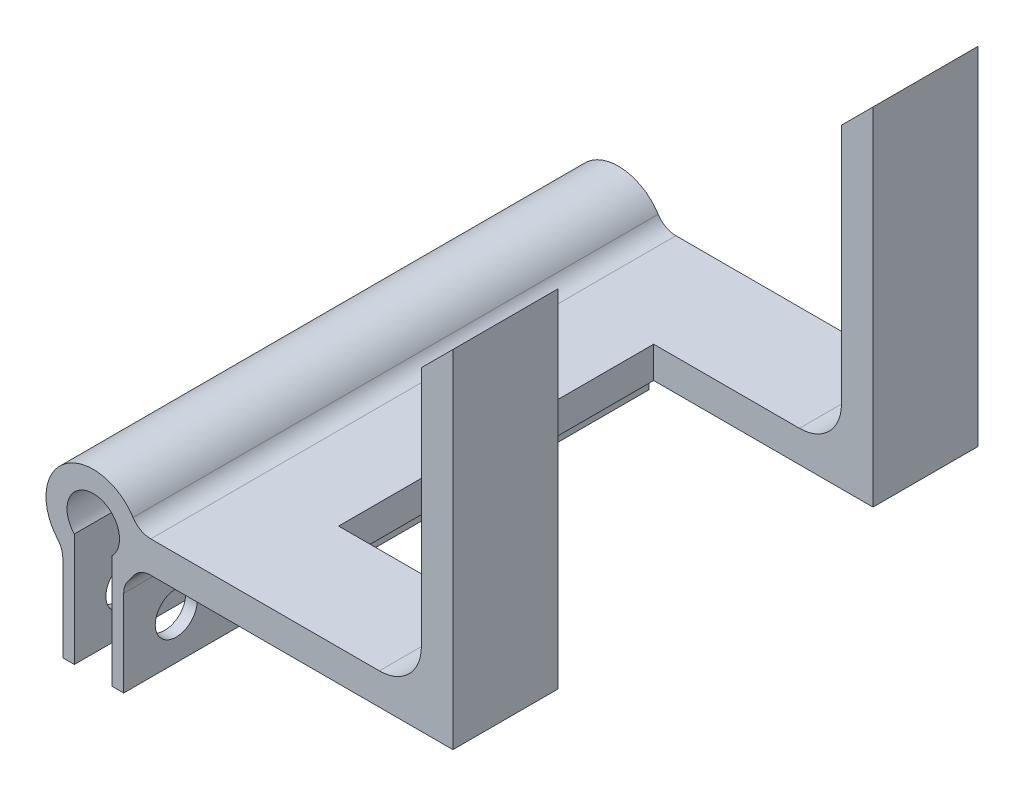
ISO-10303-21;
HEADER;
FILE_DESCRIPTION(('STEP AP214'),'2;1');
FILE_NAME('part.step','',(''),(''),'','','');
FILE_SCHEMA(('AUTOMOTIVE_DESIGN { 1 0 10303 214 1 1 1 1 }'));
ENDSEC;
DATA;
#1=APPLICATION_CONTEXT('core data for automotive mechanical design processes');
#2=APPLICATION_PROTOCOL_DEFINITION('international standard','automotive_design',2000,#1);
#3=PRODUCT_CONTEXT('',#1,'mechanical');
#4=PRODUCT('Part','Part','',(#3));
#5=PRODUCT_RELATED_PRODUCT_CATEGORY('part','',(#4));
#6=PRODUCT_DEFINITION_FORMATION('','',#4);
#7=PRODUCT_DEFINITION_CONTEXT('part definition',#1,'design');
#8=PRODUCT_DEFINITION('design','',#6,#7);
#9=PRODUCT_DEFINITION_SHAPE('','',#8);
#10=(LENGTH_UNIT() NAMED_UNIT(*) SI_UNIT(.MILLI.,.METRE.));
#11=(NAMED_UNIT(*) PLANE_ANGLE_UNIT() SI_UNIT($,.RADIAN.));
#12=(NAMED_UNIT(*) SI_UNIT($,.STERADIAN.) SOLID_ANGLE_UNIT());
#13=UNCERTAINTY_MEASURE_WITH_UNIT(LENGTH_MEASURE(1.E-05),#10,'distance_accuracy_value','');
#14=(GEOMETRIC_REPRESENTATION_CONTEXT(3) GLOBAL_UNCERTAINTY_ASSIGNED_CONTEXT((#13)) GLOBAL_UNIT_ASSIGNED_CONTEXT((#10,
#11,#12)) REPRESENTATION_CONTEXT('',''));
#15=CARTESIAN_POINT('',(0.,0.,0.));
#16=DIRECTION('',(0.,0.,1.));
#17=DIRECTION('',(1.,0.,0.));
#18=AXIS2_PLACEMENT_3D('',#15,#16,#17);
#19=CARTESIAN_POINT('',(17.1213203435596,0.75,0.));
#20=DIRECTION('',(1.,0.,0.));
#21=DIRECTION('',(0.,0.,-1.));
#22=AXIS2_PLACEMENT_3D('',#19,#20,#21);
#23=PLANE('',#22);
#24=DIRECTION('',(0.,-1.,0.));
#25=VECTOR('',#24,1.);
#26=CARTESIAN_POINT('',(17.1213203435596,0.75,20.));
#27=LINE('',#26,#25);
#28=CARTESIAN_POINT('',(17.1213203435596,15.75,20.));
#29=VERTEX_POINT('',#28);
#30=CARTESIAN_POINT('',(17.1213203435596,-0.75,20.));
#31=VERTEX_POINT('',#30);
#32=EDGE_CURVE('E242',#29,#31,#27,.T.);
#33=ORIENTED_EDGE('',*,*,#32,.F.);
#34=DIRECTION('',(0.,0.,-1.));
#35=VECTOR('',#34,1.);
#36=CARTESIAN_POINT('',(17.1213203435596,15.75,25.));
#37=LINE('',#36,#35);
#38=CARTESIAN_POINT('',(17.1213203435596,15.75,25.));
#39=VERTEX_POINT('',#38);
#40=EDGE_CURVE('E257',#39,#29,#37,.T.);
#41=ORIENTED_EDGE('',*,*,#40,.F.);
#42=DIRECTION('',(0.,1.,0.));
#43=VECTOR('',#42,1.);
#44=CARTESIAN_POINT('',(17.1213203435596,0.75,25.));
#45=LINE('',#44,#43);
#46=CARTESIAN_POINT('',(17.1213203435596,-0.75,25.));
#47=VERTEX_POINT('',#46);
#48=EDGE_CURVE('E276',#47,#39,#45,.T.);
#49=ORIENTED_EDGE('',*,*,#48,.F.);
#50=DIRECTION('',(0.,0.,1.));
#51=VECTOR('',#50,1.);
#52=CARTESIAN_POINT('',(17.1213203435596,-0.75,0.));
#53=LINE('',#52,#51);
#54=EDGE_CURVE('E273',#31,#47,#53,.T.);
#55=ORIENTED_EDGE('',*,*,#54,.F.);
#56=EDGE_LOOP('',(#33,#41,#49,#55));
#57=FACE_BOUND('',#56,.T.);
#58=ADVANCED_FACE('F41',(#57),#23,.T.);
#59=CARTESIAN_POINT('',(15.6213203435596,15.75,0.));
#60=DIRECTION('',(1.,0.,0.));
#61=DIRECTION('',(0.,0.,-1.));
#62=AXIS2_PLACEMENT_3D('',#59,#60,#61);
#63=PLANE('',#62);
#64=DIRECTION('',(0.,-1.,0.));
#65=VECTOR('',#64,1.);
#66=CARTESIAN_POINT('',(15.6213203435596,15.75,25.));
#67=LINE('',#66,#65);
#68=CARTESIAN_POINT('',(15.6213203435596,14.25,25.));
#69=VERTEX_POINT('',#68);
#70=CARTESIAN_POINT('',(15.6213203435596,2.75,25.));
#71=VERTEX_POINT('',#70);
#72=EDGE_CURVE('E260',#69,#71,#67,.T.);
#73=ORIENTED_EDGE('',*,*,#72,.F.);
#74=DIRECTION('',(0.,0.,-1.));
#75=VECTOR('',#74,1.);
#76=CARTESIAN_POINT('',(15.6213203435596,14.25,20.));
#77=LINE('',#76,#75);
#78=CARTESIAN_POINT('',(15.6213203435596,14.25,20.));
#79=VERTEX_POINT('',#78);
#80=EDGE_CURVE('E50',#69,#79,#77,.T.);
#81=ORIENTED_EDGE('',*,*,#80,.T.);
#82=DIRECTION('',(0.,-1.,0.));
#83=VECTOR('',#82,1.);
#84=CARTESIAN_POINT('',(15.6213203435596,15.75,20.));
#85=LINE('',#84,#83);
#86=CARTESIAN_POINT('',(15.6213203435596,2.75,20.));
#87=VERTEX_POINT('',#86);
#88=EDGE_CURVE('E240',#79,#87,#85,.T.);
#89=ORIENTED_EDGE('',*,*,#88,.T.);
#90=DIRECTION('',(0.,0.,1.));
#91=VECTOR('',#90,1.);
#92=CARTESIAN_POINT('',(15.6213203435596,2.75,0.));
#93=LINE('',#92,#91);
#94=EDGE_CURVE('E224',#87,#71,#93,.T.);
#95=ORIENTED_EDGE('',*,*,#94,.T.);
#96=EDGE_LOOP('',(#73,#81,#89,#95));
#97=FACE_BOUND('',#96,.T.);
#98=ADVANCED_FACE('F544',(#97),#63,.F.);
#99=CARTESIAN_POINT('',(2.12132034355964,0.75,0.));
#100=DIRECTION('',(0.,1.,0.));
#101=DIRECTION('',(0.,0.,1.));
#102=AXIS2_PLACEMENT_3D('',#99,#100,#101);
#103=PLANE('',#102);
#104=DIRECTION('',(-1.,0.,0.));
#105=VECTOR('',#104,1.);
#106=CARTESIAN_POINT('',(2.12132034355964,0.75,25.));
#107=LINE('',#106,#105);
#108=CARTESIAN_POINT('',(13.6213203435596,0.75,25.));
#109=VERTEX_POINT('',#108);
#110=CARTESIAN_POINT('',(2.73861278752583,0.75,25.));
#111=VERTEX_POINT('',#110);
#112=EDGE_CURVE('E268',#109,#111,#107,.T.);
#113=ORIENTED_EDGE('',*,*,#112,.F.);
#114=DIRECTION('',(0.,0.,1.));
#115=VECTOR('',#114,1.);
#116=CARTESIAN_POINT('',(13.6213203435596,0.75,0.));
#117=LINE('',#116,#115);
#118=CARTESIAN_POINT('',(13.6213203435596,0.75,20.));
#119=VERTEX_POINT('',#118);
#120=EDGE_CURVE('E380',#109,#119,#117,.F.);
#121=ORIENTED_EDGE('',*,*,#120,.T.);
#122=DIRECTION('',(1.,0.,0.));
#123=VECTOR('',#122,1.);
#124=CARTESIAN_POINT('',(2.12132034355965,0.75,20.));
#125=LINE('',#124,#123);
#126=CARTESIAN_POINT('',(6.68164111748477,0.750000000000001,20.));
#127=VERTEX_POINT('',#126);
#128=EDGE_CURVE('E249',#127,#119,#125,.T.);
#129=ORIENTED_EDGE('',*,*,#128,.F.);
#130=DIRECTION('',(0.,0.,1.));
#131=VECTOR('',#130,1.);
#132=CARTESIAN_POINT('',(6.68164111748477,0.75,0.));
#133=LINE('',#132,#131);
#134=CARTESIAN_POINT('',(6.68164111748477,0.750000000000001,5.));
#135=VERTEX_POINT('',#134);
#136=EDGE_CURVE('E254',#135,#127,#133,.T.);
#137=ORIENTED_EDGE('',*,*,#136,.F.);
#138=DIRECTION('',(-1.,0.,0.));
#139=VECTOR('',#138,1.);
#140=CARTESIAN_POINT('',(2.12132034355964,0.75,5.));
#141=LINE('',#140,#139);
#142=CARTESIAN_POINT('',(13.6213203435596,0.75,5.));
#143=VERTEX_POINT('',#142);
#144=EDGE_CURVE('E233',#143,#135,#141,.T.);
#145=ORIENTED_EDGE('',*,*,#144,.F.);
#146=DIRECTION('',(0.,0.,1.));
#147=VECTOR('',#146,1.);
#148=CARTESIAN_POINT('',(13.6213203435596,0.75,0.));
#149=LINE('',#148,#147);
#150=CARTESIAN_POINT('',(13.6213203435596,0.75,0.));
#151=VERTEX_POINT('',#150);
#152=EDGE_CURVE('E378',#143,#151,#149,.F.);
#153=ORIENTED_EDGE('',*,*,#152,.T.);
#154=DIRECTION('',(-1.,0.,0.));
#155=VECTOR('',#154,1.);
#156=CARTESIAN_POINT('',(2.12132034355964,0.75,0.));
#157=LINE('',#156,#155);
#158=CARTESIAN_POINT('',(2.73861278752583,0.75,0.));
#159=VERTEX_POINT('',#158);
#160=EDGE_CURVE('E271',#151,#159,#157,.T.);
#161=ORIENTED_EDGE('',*,*,#160,.T.);
#162=DIRECTION('',(0.,0.,-1.));
#163=VECTOR('',#162,1.);
#164=CARTESIAN_POINT('',(2.73861278752583,0.75,0.));
#165=LINE('',#164,#163);
#166=EDGE_CURVE('E357',#159,#111,#165,.F.);
#167=ORIENTED_EDGE('',*,*,#166,.T.);
#168=EDGE_LOOP('',(#113,#121,#129,#137,#145,#153,#161,#167));
#169=FACE_BOUND('',#168,.T.);
#170=ADVANCED_FACE('F487',(#169),#103,.T.);
#171=CARTESIAN_POINT('',(0.,0.,25.));
#172=DIRECTION('',(0.,0.,-1.));
#173=DIRECTION('',(-1.,0.,0.));
#174=AXIS2_PLACEMENT_3D('',#171,#172,#173);
#175=CYLINDRICAL_SURFACE('',#174,2.25);
#176=CARTESIAN_POINT('',(0.,0.,0.));
#177=DIRECTION('',(0.,0.,1.));
#178=DIRECTION('',(1.,0.,0.));
#179=AXIS2_PLACEMENT_3D('',#176,#177,#178);
#180=CIRCLE('',#179,2.25);
#181=CARTESIAN_POINT('',(1.89596269905634,1.21153846153846,0.));
#182=VERTEX_POINT('',#181);
#183=CARTESIAN_POINT('',(-1.69615384615385,-1.47836468105049,0.));
#184=VERTEX_POINT('',#183);
#185=EDGE_CURVE('E324',#182,#184,#180,.T.);
#186=ORIENTED_EDGE('',*,*,#185,.T.);
#187=DIRECTION('',(0.,0.,-1.));
#188=VECTOR('',#187,1.);
#189=CARTESIAN_POINT('',(-1.69615384615385,-1.47836468105049,25.));
#190=LINE('',#189,#188);
#191=CARTESIAN_POINT('',(-1.69615384615385,-1.47836468105049,25.));
#192=VERTEX_POINT('',#191);
#193=EDGE_CURVE('E342',#184,#192,#190,.F.);
#194=ORIENTED_EDGE('',*,*,#193,.T.);
#195=CARTESIAN_POINT('',(0.,0.,25.));
#196=DIRECTION('',(0.,0.,1.));
#197=DIRECTION('',(1.,0.,0.));
#198=AXIS2_PLACEMENT_3D('',#195,#196,#197);
#199=CIRCLE('',#198,2.25);
#200=CARTESIAN_POINT('',(1.89596269905634,1.21153846153846,25.));
#201=VERTEX_POINT('',#200);
#202=EDGE_CURVE('E331',#201,#192,#199,.T.);
#203=ORIENTED_EDGE('',*,*,#202,.F.);
#204=DIRECTION('',(0.,0.,-1.));
#205=VECTOR('',#204,1.);
#206=CARTESIAN_POINT('',(1.89596269905634,1.21153846153846,25.));
#207=LINE('',#206,#205);
#208=EDGE_CURVE('E340',#201,#182,#207,.T.);
#209=ORIENTED_EDGE('',*,*,#208,.T.);
#210=EDGE_LOOP('',(#186,#194,#203,#209));
#211=FACE_BOUND('',#210,.T.);
#212=ADVANCED_FACE('F469',(#211),#175,.T.);
#213=CARTESIAN_POINT('',(1.69615384615385,-1.47836468105049,25.));
#214=VERTEX_POINT('',#213);
#215=CARTESIAN_POINT('',(1.89596269905634,-1.21153846153846,25.));
#216=VERTEX_POINT('',#215);
#217=EDGE_CURVE('E327',#214,#216,#199,.T.);
#218=ORIENTED_EDGE('',*,*,#217,.F.);
#219=DIRECTION('',(0.,0.,-1.));
#220=VECTOR('',#219,1.);
#221=CARTESIAN_POINT('',(1.69615384615385,-1.47836468105049,25.));
#222=LINE('',#221,#220);
#223=CARTESIAN_POINT('',(1.69615384615385,-1.47836468105049,0.));
#224=VERTEX_POINT('',#223);
#225=EDGE_CURVE('E353',#214,#224,#222,.T.);
#226=ORIENTED_EDGE('',*,*,#225,.T.);
#227=CARTESIAN_POINT('',(1.89596269905634,-1.21153846153846,0.));
#228=VERTEX_POINT('',#227);
#229=EDGE_CURVE('E332',#224,#228,#180,.T.);
#230=ORIENTED_EDGE('',*,*,#229,.T.);
#231=DIRECTION('',(0.,0.,-1.));
#232=VECTOR('',#231,1.);
#233=CARTESIAN_POINT('',(1.89596269905634,-1.21153846153846,25.));
#234=LINE('',#233,#232);
#235=EDGE_CURVE('E350',#228,#216,#234,.F.);
#236=ORIENTED_EDGE('',*,*,#235,.T.);
#237=EDGE_LOOP('',(#218,#226,#230,#236));
#238=FACE_BOUND('',#237,.T.);
#239=ADVANCED_FACE('F508',(#238),#175,.T.);
#240=CARTESIAN_POINT('',(0.,0.,25.));
#241=DIRECTION('',(0.,0.,1.));
#242=DIRECTION('',(1.,0.,0.));
#243=AXIS2_PLACEMENT_3D('',#240,#241,#242);
#244=PLANE('',#243);
#245=ORIENTED_EDGE('',*,*,#48,.T.);
#246=DIRECTION('',(-0.707106781186545,-0.70710678118655,0.));
#247=VECTOR('',#246,1.);
#248=CARTESIAN_POINT('',(0.685660171779874,-0.685660171779869,25.));
#249=LINE('',#248,#247);
#250=EDGE_CURVE('E64',#39,#69,#249,.T.);
#251=ORIENTED_EDGE('',*,*,#250,.T.);
#252=ORIENTED_EDGE('',*,*,#72,.T.);
#253=CARTESIAN_POINT('',(13.6213203435596,2.75,25.));
#254=DIRECTION('',(0.,0.,1.));
#255=DIRECTION('',(1.,0.,0.));
#256=AXIS2_PLACEMENT_3D('',#253,#254,#255);
#257=CIRCLE('',#256,2.);
#258=EDGE_CURVE('E385',#71,#109,#257,.F.);
#259=ORIENTED_EDGE('',*,*,#258,.T.);
#260=ORIENTED_EDGE('',*,*,#112,.T.);
#261=CARTESIAN_POINT('',(2.73861278752583,1.75,25.));
#262=DIRECTION('',(0.,0.,1.));
#263=DIRECTION('',(1.,0.,0.));
#264=AXIS2_PLACEMENT_3D('',#261,#262,#263);
#265=CIRCLE('',#264,1.);
#266=EDGE_CURVE('E372',#111,#201,#265,.F.);
#267=ORIENTED_EDGE('',*,*,#266,.T.);
#268=ORIENTED_EDGE('',*,*,#202,.T.);
#269=CARTESIAN_POINT('',(-2.45,-2.13541565040626,25.));
#270=DIRECTION('',(0.,0.,1.));
#271=DIRECTION('',(1.,0.,0.));
#272=AXIS2_PLACEMENT_3D('',#269,#270,#271);
#273=CIRCLE('',#272,1.);
#274=CARTESIAN_POINT('',(-1.45,-2.13541565040626,25.));
#275=VERTEX_POINT('',#274);
#276=EDGE_CURVE('E360',#192,#275,#273,.F.);
#277=ORIENTED_EDGE('',*,*,#276,.T.);
#278=DIRECTION('',(0.,-1.,0.));
#279=VECTOR('',#278,1.);
#280=CARTESIAN_POINT('',(-1.45,0.,25.));
#281=LINE('',#280,#279);
#282=CARTESIAN_POINT('',(-1.45,-6.25,25.));
#283=VERTEX_POINT('',#282);
#284=EDGE_CURVE('E310',#275,#283,#281,.T.);
#285=ORIENTED_EDGE('',*,*,#284,.T.);
#286=DIRECTION('',(-1.,0.,0.));
#287=VECTOR('',#286,1.);
#288=CARTESIAN_POINT('',(-0.9,-6.25,25.));
#289=LINE('',#288,#287);
#290=CARTESIAN_POINT('',(-0.9,-6.25,25.));
#291=VERTEX_POINT('',#290);
#292=EDGE_CURVE('E283',#291,#283,#289,.T.);
#293=ORIENTED_EDGE('',*,*,#292,.F.);
#294=DIRECTION('',(0.,-1.,0.));
#295=VECTOR('',#294,1.);
#296=CARTESIAN_POINT('',(-0.9,0.,25.));
#297=LINE('',#296,#295);
#298=CARTESIAN_POINT('',(-0.9,-0.867467578644874,25.));
#299=VERTEX_POINT('',#298);
#300=EDGE_CURVE('E316',#299,#291,#297,.T.);
#301=ORIENTED_EDGE('',*,*,#300,.F.);
#302=CARTESIAN_POINT('',(0.,0.,25.));
#303=DIRECTION('',(0.,0.,1.));
#304=DIRECTION('',(1.,0.,0.));
#305=AXIS2_PLACEMENT_3D('',#302,#303,#304);
#306=CIRCLE('',#305,1.25);
#307=CARTESIAN_POINT('',(0.9,-0.867467578644874,25.));
#308=VERTEX_POINT('',#307);
#309=EDGE_CURVE('E321',#308,#299,#306,.T.);
#310=ORIENTED_EDGE('',*,*,#309,.F.);
#311=DIRECTION('',(0.,-1.,0.));
#312=VECTOR('',#311,1.);
#313=CARTESIAN_POINT('',(0.9,0.,25.));
#314=LINE('',#313,#312);
#315=CARTESIAN_POINT('',(0.9,-6.25,25.));
#316=VERTEX_POINT('',#315);
#317=EDGE_CURVE('E308',#308,#316,#314,.T.);
#318=ORIENTED_EDGE('',*,*,#317,.T.);
#319=DIRECTION('',(-1.,0.,0.));
#320=VECTOR('',#319,1.);
#321=CARTESIAN_POINT('',(1.45,-6.25,25.));
#322=LINE('',#321,#320);
#323=CARTESIAN_POINT('',(1.45,-6.25,25.));
#324=VERTEX_POINT('',#323);
#325=EDGE_CURVE('E295',#324,#316,#322,.T.);
#326=ORIENTED_EDGE('',*,*,#325,.F.);
#327=DIRECTION('',(0.,-1.,0.));
#328=VECTOR('',#327,1.);
#329=CARTESIAN_POINT('',(1.45,0.,25.));
#330=LINE('',#329,#328);
#331=CARTESIAN_POINT('',(1.45,-2.13541565040626,25.));
#332=VERTEX_POINT('',#331);
#333=EDGE_CURVE('E304',#332,#324,#330,.T.);
#334=ORIENTED_EDGE('',*,*,#333,.F.);
#335=CARTESIAN_POINT('',(2.45,-2.13541565040626,25.));
#336=DIRECTION('',(0.,0.,1.));
#337=DIRECTION('',(1.,0.,0.));
#338=AXIS2_PLACEMENT_3D('',#335,#336,#337);
#339=CIRCLE('',#338,1.);
#340=EDGE_CURVE('E364',#332,#214,#339,.F.);
#341=ORIENTED_EDGE('',*,*,#340,.T.);
#342=ORIENTED_EDGE('',*,*,#217,.T.);
#343=CARTESIAN_POINT('',(2.73861278752583,-1.75,25.));
#344=DIRECTION('',(0.,0.,1.));
#345=DIRECTION('',(1.,0.,0.));
#346=AXIS2_PLACEMENT_3D('',#343,#344,#345);
#347=CIRCLE('',#346,1.);
#348=CARTESIAN_POINT('',(2.73861278752583,-0.75,25.));
#349=VERTEX_POINT('',#348);
#350=EDGE_CURVE('E368',#216,#349,#347,.F.);
#351=ORIENTED_EDGE('',*,*,#350,.T.);
#352=DIRECTION('',(1.,0.,0.));
#353=VECTOR('',#352,1.);
#354=CARTESIAN_POINT('',(2.12132034355964,-0.75,25.));
#355=LINE('',#354,#353);
#356=EDGE_CURVE('E264',#349,#47,#355,.T.);
#357=ORIENTED_EDGE('',*,*,#356,.T.);
#358=EDGE_LOOP('',(#245,#251,#252,#259,#260,#267,#268,#277,#285,#293,#301,#310,#318,#326,#334,
#341,#342,#351,#357));
#359=FACE_BOUND('',#358,.T.);
#360=ADVANCED_FACE('F498',(#359),#244,.T.);
#361=CARTESIAN_POINT('',(0.,0.,0.));
#362=DIRECTION('',(0.,0.,1.));
#363=DIRECTION('',(1.,0.,0.));
#364=AXIS2_PLACEMENT_3D('',#361,#362,#363);
#365=PLANE('',#364);
#366=DIRECTION('',(0.,-1.,0.));
#367=VECTOR('',#366,1.);
#368=CARTESIAN_POINT('',(15.6213203435596,15.75,0.));
#369=LINE('',#368,#367);
#370=CARTESIAN_POINT('',(15.6213203435596,14.25,0.));
#371=VERTEX_POINT('',#370);
#372=CARTESIAN_POINT('',(15.6213203435596,2.75,0.));
#373=VERTEX_POINT('',#372);
#374=EDGE_CURVE('E262',#371,#373,#369,.T.);
#375=ORIENTED_EDGE('',*,*,#374,.F.);
#376=DIRECTION('',(0.707106781186545,0.70710678118655,0.));
#377=VECTOR('',#376,1.);
#378=CARTESIAN_POINT('',(17.1213203435596,15.75,0.));
#379=LINE('',#378,#377);
#380=CARTESIAN_POINT('',(17.1213203435596,15.75,0.));
#381=VERTEX_POINT('',#380);
#382=EDGE_CURVE('E409',#371,#381,#379,.T.);
#383=ORIENTED_EDGE('',*,*,#382,.T.);
#384=DIRECTION('',(0.,1.,0.));
#385=VECTOR('',#384,1.);
#386=CARTESIAN_POINT('',(17.1213203435596,0.75,0.));
#387=LINE('',#386,#385);
#388=CARTESIAN_POINT('',(17.1213203435596,-0.75,0.));
#389=VERTEX_POINT('',#388);
#390=EDGE_CURVE('E267',#389,#381,#387,.T.);
#391=ORIENTED_EDGE('',*,*,#390,.F.);
#392=DIRECTION('',(1.,0.,0.));
#393=VECTOR('',#392,1.);
#394=CARTESIAN_POINT('',(2.12132034355964,-0.75,0.));
#395=LINE('',#394,#393);
#396=CARTESIAN_POINT('',(2.73861278752583,-0.75,0.));
#397=VERTEX_POINT('',#396);
#398=EDGE_CURVE('E265',#397,#389,#395,.T.);
#399=ORIENTED_EDGE('',*,*,#398,.F.);
#400=CARTESIAN_POINT('',(2.73861278752583,-1.75,0.));
#401=DIRECTION('',(0.,0.,1.));
#402=DIRECTION('',(1.,0.,0.));
#403=AXIS2_PLACEMENT_3D('',#400,#401,#402);
#404=CIRCLE('',#403,1.);
#405=EDGE_CURVE('E370',#397,#228,#404,.T.);
#406=ORIENTED_EDGE('',*,*,#405,.T.);
#407=ORIENTED_EDGE('',*,*,#229,.F.);
#408=CARTESIAN_POINT('',(2.45,-2.13541565040626,0.));
#409=DIRECTION('',(0.,0.,1.));
#410=DIRECTION('',(1.,0.,0.));
#411=AXIS2_PLACEMENT_3D('',#408,#409,#410);
#412=CIRCLE('',#411,1.);
#413=CARTESIAN_POINT('',(1.45,-2.13541565040626,0.));
#414=VERTEX_POINT('',#413);
#415=EDGE_CURVE('E366',#224,#414,#412,.T.);
#416=ORIENTED_EDGE('',*,*,#415,.T.);
#417=DIRECTION('',(0.,-1.,0.));
#418=VECTOR('',#417,1.);
#419=CARTESIAN_POINT('',(1.45,0.,0.));
#420=LINE('',#419,#418);
#421=CARTESIAN_POINT('',(1.45,-6.25,0.));
#422=VERTEX_POINT('',#421);
#423=EDGE_CURVE('E305',#414,#422,#420,.T.);
#424=ORIENTED_EDGE('',*,*,#423,.T.);
#425=DIRECTION('',(1.,0.,0.));
#426=VECTOR('',#425,1.);
#427=CARTESIAN_POINT('',(0.9,-6.25,0.));
#428=LINE('',#427,#426);
#429=CARTESIAN_POINT('',(0.9,-6.25,0.));
#430=VERTEX_POINT('',#429);
#431=EDGE_CURVE('E301',#430,#422,#428,.T.);
#432=ORIENTED_EDGE('',*,*,#431,.F.);
#433=DIRECTION('',(0.,-1.,0.));
#434=VECTOR('',#433,1.);
#435=CARTESIAN_POINT('',(0.9,0.,0.));
#436=LINE('',#435,#434);
#437=CARTESIAN_POINT('',(0.9,-0.867467578644874,0.));
#438=VERTEX_POINT('',#437);
#439=EDGE_CURVE('E307',#438,#430,#436,.T.);
#440=ORIENTED_EDGE('',*,*,#439,.F.);
#441=CARTESIAN_POINT('',(0.,0.,0.));
#442=DIRECTION('',(0.,0.,1.));
#443=DIRECTION('',(1.,0.,0.));
#444=AXIS2_PLACEMENT_3D('',#441,#442,#443);
#445=CIRCLE('',#444,1.25);
#446=CARTESIAN_POINT('',(-0.9,-0.867467578644874,0.));
#447=VERTEX_POINT('',#446);
#448=EDGE_CURVE('E318',#438,#447,#445,.T.);
#449=ORIENTED_EDGE('',*,*,#448,.T.);
#450=DIRECTION('',(0.,-1.,0.));
#451=VECTOR('',#450,1.);
#452=CARTESIAN_POINT('',(-0.9,0.,0.));
#453=LINE('',#452,#451);
#454=CARTESIAN_POINT('',(-0.9,-6.25,0.));
#455=VERTEX_POINT('',#454);
#456=EDGE_CURVE('E315',#447,#455,#453,.T.);
#457=ORIENTED_EDGE('',*,*,#456,.T.);
#458=DIRECTION('',(1.,0.,0.));
#459=VECTOR('',#458,1.);
#460=CARTESIAN_POINT('',(-1.45,-6.25,0.));
#461=LINE('',#460,#459);
#462=CARTESIAN_POINT('',(-1.45,-6.25,0.));
#463=VERTEX_POINT('',#462);
#464=EDGE_CURVE('E289',#463,#455,#461,.T.);
#465=ORIENTED_EDGE('',*,*,#464,.F.);
#466=DIRECTION('',(0.,-1.,0.));
#467=VECTOR('',#466,1.);
#468=CARTESIAN_POINT('',(-1.45,0.,0.));
#469=LINE('',#468,#467);
#470=CARTESIAN_POINT('',(-1.45,-2.13541565040626,0.));
#471=VERTEX_POINT('',#470);
#472=EDGE_CURVE('E313',#471,#463,#469,.T.);
#473=ORIENTED_EDGE('',*,*,#472,.F.);
#474=CARTESIAN_POINT('',(-2.45,-2.13541565040626,0.));
#475=DIRECTION('',(0.,0.,1.));
#476=DIRECTION('',(1.,0.,0.));
#477=AXIS2_PLACEMENT_3D('',#474,#475,#476);
#478=CIRCLE('',#477,1.);
#479=EDGE_CURVE('E362',#471,#184,#478,.T.);
#480=ORIENTED_EDGE('',*,*,#479,.T.);
#481=ORIENTED_EDGE('',*,*,#185,.F.);
#482=CARTESIAN_POINT('',(2.73861278752583,1.75,0.));
#483=DIRECTION('',(0.,0.,1.));
#484=DIRECTION('',(1.,0.,0.));
#485=AXIS2_PLACEMENT_3D('',#482,#483,#484);
#486=CIRCLE('',#485,1.);
#487=EDGE_CURVE('E225',#182,#159,#486,.T.);
#488=ORIENTED_EDGE('',*,*,#487,.T.);
#489=ORIENTED_EDGE('',*,*,#160,.F.);
#490=CARTESIAN_POINT('',(13.6213203435596,2.75,0.));
#491=DIRECTION('',(0.,0.,1.));
#492=DIRECTION('',(1.,0.,0.));
#493=AXIS2_PLACEMENT_3D('',#490,#491,#492);
#494=CIRCLE('',#493,2.);
#495=EDGE_CURVE('E392',#151,#373,#494,.T.);
#496=ORIENTED_EDGE('',*,*,#495,.T.);
#497=EDGE_LOOP('',(#375,#383,#391,#399,#406,#407,#416,#424,#432,#440,#449,#457,#465,#473,#480,
#481,#488,#489,#496));
#498=FACE_BOUND('',#497,.T.);
#499=ADVANCED_FACE('F415',(#498),#365,.F.);
#500=CARTESIAN_POINT('',(0.,0.,25.));
#501=DIRECTION('',(0.,0.,-1.));
#502=DIRECTION('',(-1.,0.,0.));
#503=AXIS2_PLACEMENT_3D('',#500,#501,#502);
#504=CYLINDRICAL_SURFACE('',#503,1.25);
#505=DIRECTION('',(0.,0.,-1.));
#506=VECTOR('',#505,1.);
#507=CARTESIAN_POINT('',(-0.9,-0.867467578644874,25.));
#508=LINE('',#507,#506);
#509=EDGE_CURVE('E337',#447,#299,#508,.F.);
#510=ORIENTED_EDGE('',*,*,#509,.F.);
#511=ORIENTED_EDGE('',*,*,#448,.F.);
#512=DIRECTION('',(0.,0.,-1.));
#513=VECTOR('',#512,1.);
#514=CARTESIAN_POINT('',(0.9,-0.867467578644874,25.));
#515=LINE('',#514,#513);
#516=EDGE_CURVE('E330',#308,#438,#515,.T.);
#517=ORIENTED_EDGE('',*,*,#516,.F.);
#518=ORIENTED_EDGE('',*,*,#309,.T.);
#519=EDGE_LOOP('',(#510,#511,#517,#518));
#520=FACE_BOUND('',#519,.T.);
#521=ADVANCED_FACE('F451',(#520),#504,.F.);
#522=CARTESIAN_POINT('',(-1.45,0.,0.));
#523=DIRECTION('',(-1.,0.,0.));
#524=DIRECTION('',(0.,0.,1.));
#525=AXIS2_PLACEMENT_3D('',#522,#523,#524);
#526=PLANE('',#525);
#527=CARTESIAN_POINT('',(-1.45,-4.19270782520313,2.5));
#528=DIRECTION('',(-1.,0.,0.));
#529=DIRECTION('',(0.,0.,1.));
#530=AXIS2_PLACEMENT_3D('',#527,#528,#529);
#531=CIRCLE('',#530,1.);
#532=CARTESIAN_POINT('',(-1.45,-4.19270782520313,3.5));
#533=VERTEX_POINT('',#532);
#534=EDGE_CURVE('E400',#533,#533,#531,.T.);
#535=ORIENTED_EDGE('',*,*,#534,.F.);
#536=EDGE_LOOP('',(#535));
#537=FACE_BOUND('',#536,.T.);
#538=CARTESIAN_POINT('',(-1.45,-4.19270782520313,22.5));
#539=DIRECTION('',(-1.,0.,0.));
#540=DIRECTION('',(0.,0.,1.));
#541=AXIS2_PLACEMENT_3D('',#538,#539,#540);
#542=CIRCLE('',#541,1.);
#543=CARTESIAN_POINT('',(-1.45,-4.19270782520313,23.5));
#544=VERTEX_POINT('',#543);
#545=EDGE_CURVE('E438',#544,#544,#542,.T.);
#546=ORIENTED_EDGE('',*,*,#545,.F.);
#547=EDGE_LOOP('',(#546));
#548=FACE_BOUND('',#547,.T.);
#549=ORIENTED_EDGE('',*,*,#284,.F.);
#550=DIRECTION('',(0.,0.,-1.));
#551=VECTOR('',#550,1.);
#552=CARTESIAN_POINT('',(-1.45,-2.13541565040626,0.));
#553=LINE('',#552,#551);
#554=EDGE_CURVE('E345',#275,#471,#553,.T.);
#555=ORIENTED_EDGE('',*,*,#554,.T.);
#556=ORIENTED_EDGE('',*,*,#472,.T.);
#557=DIRECTION('',(0.,0.,-1.));
#558=VECTOR('',#557,1.);
#559=CARTESIAN_POINT('',(-1.45,-6.25,25.));
#560=LINE('',#559,#558);
#561=EDGE_CURVE('E286',#283,#463,#560,.T.);
#562=ORIENTED_EDGE('',*,*,#561,.F.);
#563=EDGE_LOOP('',(#549,#555,#556,#562));
#564=FACE_BOUND('',#563,.T.);
#565=ADVANCED_FACE('F447',(#537,#548,#564),#526,.T.);
#566=CARTESIAN_POINT('',(-0.9,0.,0.));
#567=DIRECTION('',(-1.,0.,0.));
#568=DIRECTION('',(0.,0.,1.));
#569=AXIS2_PLACEMENT_3D('',#566,#567,#568);
#570=PLANE('',#569);
#571=CARTESIAN_POINT('',(-0.9,-4.19270782520313,2.5));
#572=DIRECTION('',(-1.,0.,0.));
#573=DIRECTION('',(0.,0.,1.));
#574=AXIS2_PLACEMENT_3D('',#571,#572,#573);
#575=CIRCLE('',#574,1.);
#576=CARTESIAN_POINT('',(-0.9,-4.19270782520313,3.5));
#577=VERTEX_POINT('',#576);
#578=EDGE_CURVE('E234',#577,#577,#575,.T.);
#579=ORIENTED_EDGE('',*,*,#578,.T.);
#580=EDGE_LOOP('',(#579));
#581=FACE_BOUND('',#580,.T.);
#582=CARTESIAN_POINT('',(-0.9,-4.19270782520313,22.5));
#583=DIRECTION('',(-1.,0.,0.));
#584=DIRECTION('',(0.,0.,1.));
#585=AXIS2_PLACEMENT_3D('',#582,#583,#584);
#586=CIRCLE('',#585,1.);
#587=CARTESIAN_POINT('',(-0.9,-4.19270782520313,23.5));
#588=VERTEX_POINT('',#587);
#589=EDGE_CURVE('E405',#588,#588,#586,.T.);
#590=ORIENTED_EDGE('',*,*,#589,.T.);
#591=EDGE_LOOP('',(#590));
#592=FACE_BOUND('',#591,.T.);
#593=ORIENTED_EDGE('',*,*,#300,.T.);
#594=DIRECTION('',(0.,0.,1.));
#595=VECTOR('',#594,1.);
#596=CARTESIAN_POINT('',(-0.9,-6.25,0.));
#597=LINE('',#596,#595);
#598=EDGE_CURVE('E280',#455,#291,#597,.T.);
#599=ORIENTED_EDGE('',*,*,#598,.F.);
#600=ORIENTED_EDGE('',*,*,#456,.F.);
#601=ORIENTED_EDGE('',*,*,#509,.T.);
#602=EDGE_LOOP('',(#593,#599,#600,#601));
#603=FACE_BOUND('',#602,.T.);
#604=ADVANCED_FACE('F450',(#581,#592,#603),#570,.F.);
#605=CARTESIAN_POINT('',(1.45,0.,0.));
#606=DIRECTION('',(-1.,0.,0.));
#607=DIRECTION('',(0.,0.,1.));
#608=AXIS2_PLACEMENT_3D('',#605,#606,#607);
#609=PLANE('',#608);
#610=CARTESIAN_POINT('',(1.45,-4.19270782520313,2.5));
#611=DIRECTION('',(-1.,0.,0.));
#612=DIRECTION('',(0.,0.,1.));
#613=AXIS2_PLACEMENT_3D('',#610,#611,#612);
#614=CIRCLE('',#613,1.);
#615=CARTESIAN_POINT('',(1.45,-4.19270782520313,3.5));
#616=VERTEX_POINT('',#615);
#617=EDGE_CURVE('E404',#616,#616,#614,.T.);
#618=ORIENTED_EDGE('',*,*,#617,.T.);
#619=EDGE_LOOP('',(#618));
#620=FACE_BOUND('',#619,.T.);
#621=CARTESIAN_POINT('',(1.45,-4.19270782520313,22.5));
#622=DIRECTION('',(-1.,0.,0.));
#623=DIRECTION('',(0.,0.,1.));
#624=AXIS2_PLACEMENT_3D('',#621,#622,#623);
#625=CIRCLE('',#624,1.);
#626=CARTESIAN_POINT('',(1.45,-4.19270782520313,23.5));
#627=VERTEX_POINT('',#626);
#628=EDGE_CURVE('E399',#627,#627,#625,.T.);
#629=ORIENTED_EDGE('',*,*,#628,.T.);
#630=EDGE_LOOP('',(#629));
#631=FACE_BOUND('',#630,.T.);
#632=ORIENTED_EDGE('',*,*,#423,.F.);
#633=DIRECTION('',(0.,0.,1.));
#634=VECTOR('',#633,1.);
#635=CARTESIAN_POINT('',(1.45,-2.13541565040626,25.));
#636=LINE('',#635,#634);
#637=EDGE_CURVE('E347',#414,#332,#636,.T.);
#638=ORIENTED_EDGE('',*,*,#637,.T.);
#639=ORIENTED_EDGE('',*,*,#333,.T.);
#640=DIRECTION('',(0.,0.,1.));
#641=VECTOR('',#640,1.);
#642=CARTESIAN_POINT('',(1.45,-6.25,0.));
#643=LINE('',#642,#641);
#644=EDGE_CURVE('E292',#422,#324,#643,.T.);
#645=ORIENTED_EDGE('',*,*,#644,.F.);
#646=EDGE_LOOP('',(#632,#638,#639,#645));
#647=FACE_BOUND('',#646,.T.);
#648=ADVANCED_FACE('F517',(#620,#631,#647),#609,.F.);
#649=CARTESIAN_POINT('',(0.9,0.,0.));
#650=DIRECTION('',(-1.,0.,0.));
#651=DIRECTION('',(0.,0.,1.));
#652=AXIS2_PLACEMENT_3D('',#649,#650,#651);
#653=PLANE('',#652);
#654=CARTESIAN_POINT('',(0.9,-4.19270782520313,2.5));
#655=DIRECTION('',(-1.,0.,0.));
#656=DIRECTION('',(0.,0.,1.));
#657=AXIS2_PLACEMENT_3D('',#654,#655,#656);
#658=CIRCLE('',#657,1.);
#659=CARTESIAN_POINT('',(0.9,-4.19270782520313,3.5));
#660=VERTEX_POINT('',#659);
#661=EDGE_CURVE('E401',#660,#660,#658,.T.);
#662=ORIENTED_EDGE('',*,*,#661,.F.);
#663=EDGE_LOOP('',(#662));
#664=FACE_BOUND('',#663,.T.);
#665=CARTESIAN_POINT('',(0.9,-4.19270782520313,22.5));
#666=DIRECTION('',(-1.,0.,0.));
#667=DIRECTION('',(0.,0.,1.));
#668=AXIS2_PLACEMENT_3D('',#665,#666,#667);
#669=CIRCLE('',#668,1.);
#670=CARTESIAN_POINT('',(0.9,-4.19270782520313,23.5));
#671=VERTEX_POINT('',#670);
#672=EDGE_CURVE('E396',#671,#671,#669,.T.);
#673=ORIENTED_EDGE('',*,*,#672,.F.);
#674=EDGE_LOOP('',(#673));
#675=FACE_BOUND('',#674,.T.);
#676=ORIENTED_EDGE('',*,*,#317,.F.);
#677=ORIENTED_EDGE('',*,*,#516,.T.);
#678=ORIENTED_EDGE('',*,*,#439,.T.);
#679=DIRECTION('',(0.,0.,-1.));
#680=VECTOR('',#679,1.);
#681=CARTESIAN_POINT('',(0.9,-6.25,25.));
#682=LINE('',#681,#680);
#683=EDGE_CURVE('E298',#316,#430,#682,.T.);
#684=ORIENTED_EDGE('',*,*,#683,.F.);
#685=EDGE_LOOP('',(#676,#677,#678,#684));
#686=FACE_BOUND('',#685,.T.);
#687=ADVANCED_FACE('F526',(#664,#675,#686),#653,.T.);
#688=CARTESIAN_POINT('',(0.,-6.25,0.));
#689=DIRECTION('',(0.,-1.,0.));
#690=DIRECTION('',(0.,0.,-1.));
#691=AXIS2_PLACEMENT_3D('',#688,#689,#690);
#692=PLANE('',#691);
#693=ORIENTED_EDGE('',*,*,#644,.T.);
#694=ORIENTED_EDGE('',*,*,#325,.T.);
#695=ORIENTED_EDGE('',*,*,#683,.T.);
#696=ORIENTED_EDGE('',*,*,#431,.T.);
#697=EDGE_LOOP('',(#693,#694,#695,#696));
#698=FACE_BOUND('',#697,.T.);
#699=ADVANCED_FACE('F521',(#698),#692,.T.);
#700=CARTESIAN_POINT('',(0.,-6.25,0.));
#701=DIRECTION('',(0.,-1.,0.));
#702=DIRECTION('',(0.,0.,-1.));
#703=AXIS2_PLACEMENT_3D('',#700,#701,#702);
#704=PLANE('',#703);
#705=ORIENTED_EDGE('',*,*,#598,.T.);
#706=ORIENTED_EDGE('',*,*,#292,.T.);
#707=ORIENTED_EDGE('',*,*,#561,.T.);
#708=ORIENTED_EDGE('',*,*,#464,.T.);
#709=EDGE_LOOP('',(#705,#706,#707,#708));
#710=FACE_BOUND('',#709,.T.);
#711=ADVANCED_FACE('F533',(#710),#704,.T.);
#712=DIRECTION('',(0.,1.,0.));
#713=VECTOR('',#712,1.);
#714=CARTESIAN_POINT('',(17.1213203435596,0.75,5.));
#715=LINE('',#714,#713);
#716=CARTESIAN_POINT('',(17.1213203435596,-0.75,5.));
#717=VERTEX_POINT('',#716);
#718=CARTESIAN_POINT('',(17.1213203435596,15.75,5.));
#719=VERTEX_POINT('',#718);
#720=EDGE_CURVE('E244',#717,#719,#715,.T.);
#721=ORIENTED_EDGE('',*,*,#720,.F.);
#722=EDGE_CURVE('E239',#389,#717,#53,.T.);
#723=ORIENTED_EDGE('',*,*,#722,.F.);
#724=ORIENTED_EDGE('',*,*,#390,.T.);
#725=EDGE_CURVE('E256',#719,#381,#37,.T.);
#726=ORIENTED_EDGE('',*,*,#725,.F.);
#727=EDGE_LOOP('',(#721,#723,#724,#726));
#728=FACE_BOUND('',#727,.T.);
#729=ADVANCED_FACE('F422',(#728),#23,.T.);
#730=CARTESIAN_POINT('',(2.12132034355964,-0.75,0.));
#731=DIRECTION('',(0.,-1.,0.));
#732=DIRECTION('',(0.,0.,-1.));
#733=AXIS2_PLACEMENT_3D('',#730,#731,#732);
#734=PLANE('',#733);
#735=DIRECTION('',(-1.,0.,0.));
#736=VECTOR('',#735,1.);
#737=CARTESIAN_POINT('',(2.12132034355965,-0.75,20.));
#738=LINE('',#737,#736);
#739=CARTESIAN_POINT('',(6.68164111748477,-0.750000000000001,20.));
#740=VERTEX_POINT('',#739);
#741=EDGE_CURVE('E252',#31,#740,#738,.T.);
#742=ORIENTED_EDGE('',*,*,#741,.F.);
#743=ORIENTED_EDGE('',*,*,#54,.T.);
#744=ORIENTED_EDGE('',*,*,#356,.F.);
#745=DIRECTION('',(0.,0.,-1.));
#746=VECTOR('',#745,1.);
#747=CARTESIAN_POINT('',(2.73861278752583,-0.75,0.));
#748=LINE('',#747,#746);
#749=EDGE_CURVE('E355',#349,#397,#748,.T.);
#750=ORIENTED_EDGE('',*,*,#749,.T.);
#751=ORIENTED_EDGE('',*,*,#398,.T.);
#752=ORIENTED_EDGE('',*,*,#722,.T.);
#753=DIRECTION('',(1.,0.,0.));
#754=VECTOR('',#753,1.);
#755=CARTESIAN_POINT('',(2.12132034355964,-0.75,5.));
#756=LINE('',#755,#754);
#757=CARTESIAN_POINT('',(6.68164111748477,-0.750000000000001,5.));
#758=VERTEX_POINT('',#757);
#759=EDGE_CURVE('E230',#758,#717,#756,.T.);
#760=ORIENTED_EDGE('',*,*,#759,.F.);
#761=DIRECTION('',(0.,0.,-1.));
#762=VECTOR('',#761,1.);
#763=CARTESIAN_POINT('',(6.68164111748477,-0.75,0.));
#764=LINE('',#763,#762);
#765=EDGE_CURVE('E214',#740,#758,#764,.T.);
#766=ORIENTED_EDGE('',*,*,#765,.F.);
#767=EDGE_LOOP('',(#742,#743,#744,#750,#751,#752,#760,#766));
#768=FACE_BOUND('',#767,.T.);
#769=ADVANCED_FACE('F237',(#768),#734,.T.);
#770=CARTESIAN_POINT('',(-2.45,-2.13541565040626,25.));
#771=DIRECTION('',(0.,0.,-1.));
#772=DIRECTION('',(-1.,0.,0.));
#773=AXIS2_PLACEMENT_3D('',#770,#771,#772);
#774=CYLINDRICAL_SURFACE('',#773,1.);
#775=ORIENTED_EDGE('',*,*,#479,.F.);
#776=ORIENTED_EDGE('',*,*,#554,.F.);
#777=ORIENTED_EDGE('',*,*,#276,.F.);
#778=ORIENTED_EDGE('',*,*,#193,.F.);
#779=EDGE_LOOP('',(#775,#776,#777,#778));
#780=FACE_BOUND('',#779,.T.);
#781=ADVANCED_FACE('F462',(#780),#774,.F.);
#782=CARTESIAN_POINT('',(2.45,-2.13541565040626,25.));
#783=DIRECTION('',(0.,0.,-1.));
#784=DIRECTION('',(-1.,0.,0.));
#785=AXIS2_PLACEMENT_3D('',#782,#783,#784);
#786=CYLINDRICAL_SURFACE('',#785,1.);
#787=ORIENTED_EDGE('',*,*,#415,.F.);
#788=ORIENTED_EDGE('',*,*,#225,.F.);
#789=ORIENTED_EDGE('',*,*,#340,.F.);
#790=ORIENTED_EDGE('',*,*,#637,.F.);
#791=EDGE_LOOP('',(#787,#788,#789,#790));
#792=FACE_BOUND('',#791,.T.);
#793=ADVANCED_FACE('F511',(#792),#786,.F.);
#794=CARTESIAN_POINT('',(2.73861278752583,-1.75,25.));
#795=DIRECTION('',(0.,0.,-1.));
#796=DIRECTION('',(-1.,0.,0.));
#797=AXIS2_PLACEMENT_3D('',#794,#795,#796);
#798=CYLINDRICAL_SURFACE('',#797,1.);
#799=ORIENTED_EDGE('',*,*,#405,.F.);
#800=ORIENTED_EDGE('',*,*,#749,.F.);
#801=ORIENTED_EDGE('',*,*,#350,.F.);
#802=ORIENTED_EDGE('',*,*,#235,.F.);
#803=EDGE_LOOP('',(#799,#800,#801,#802));
#804=FACE_BOUND('',#803,.T.);
#805=ADVANCED_FACE('F502',(#804),#798,.F.);
#806=CARTESIAN_POINT('',(2.73861278752583,1.75,25.));
#807=DIRECTION('',(0.,0.,-1.));
#808=DIRECTION('',(-1.,0.,0.));
#809=AXIS2_PLACEMENT_3D('',#806,#807,#808);
#810=CYLINDRICAL_SURFACE('',#809,1.);
#811=ORIENTED_EDGE('',*,*,#487,.F.);
#812=ORIENTED_EDGE('',*,*,#208,.F.);
#813=ORIENTED_EDGE('',*,*,#266,.F.);
#814=ORIENTED_EDGE('',*,*,#166,.F.);
#815=EDGE_LOOP('',(#811,#812,#813,#814));
#816=FACE_BOUND('',#815,.T.);
#817=ADVANCED_FACE('F475',(#816),#810,.F.);
#818=DIRECTION('',(0.,1.,0.));
#819=VECTOR('',#818,1.);
#820=CARTESIAN_POINT('',(15.6213203435596,15.75,5.));
#821=LINE('',#820,#819);
#822=CARTESIAN_POINT('',(15.6213203435596,2.75,5.));
#823=VERTEX_POINT('',#822);
#824=CARTESIAN_POINT('',(15.6213203435596,14.25,5.));
#825=VERTEX_POINT('',#824);
#826=EDGE_CURVE('E426',#823,#825,#821,.T.);
#827=ORIENTED_EDGE('',*,*,#826,.T.);
#828=DIRECTION('',(0.,0.,-1.));
#829=VECTOR('',#828,1.);
#830=CARTESIAN_POINT('',(15.6213203435596,14.25,0.));
#831=LINE('',#830,#829);
#832=EDGE_CURVE('E407',#825,#371,#831,.T.);
#833=ORIENTED_EDGE('',*,*,#832,.T.);
#834=ORIENTED_EDGE('',*,*,#374,.T.);
#835=DIRECTION('',(0.,0.,1.));
#836=VECTOR('',#835,1.);
#837=CARTESIAN_POINT('',(15.6213203435596,2.75,0.));
#838=LINE('',#837,#836);
#839=EDGE_CURVE('E382',#373,#823,#838,.T.);
#840=ORIENTED_EDGE('',*,*,#839,.T.);
#841=EDGE_LOOP('',(#827,#833,#834,#840));
#842=FACE_BOUND('',#841,.T.);
#843=ADVANCED_FACE('F485',(#842),#63,.F.);
#844=CARTESIAN_POINT('',(6.68164111748477,-49.25,20.));
#845=DIRECTION('',(0.,0.,1.));
#846=DIRECTION('',(1.,0.,0.));
#847=AXIS2_PLACEMENT_3D('',#844,#845,#846);
#848=PLANE('',#847);
#849=ORIENTED_EDGE('',*,*,#88,.F.);
#850=DIRECTION('',(0.707106781186545,0.70710678118655,0.));
#851=VECTOR('',#850,1.);
#852=CARTESIAN_POINT('',(17.1213203435596,15.75,20.));
#853=LINE('',#852,#851);
#854=EDGE_CURVE('E11',#79,#29,#853,.T.);
#855=ORIENTED_EDGE('',*,*,#854,.T.);
#856=ORIENTED_EDGE('',*,*,#32,.T.);
#857=ORIENTED_EDGE('',*,*,#741,.T.);
#858=DIRECTION('',(0.,1.,0.));
#859=VECTOR('',#858,1.);
#860=CARTESIAN_POINT('',(6.68164111748477,-49.25,20.));
#861=LINE('',#860,#859);
#862=EDGE_CURVE('E220',#740,#127,#861,.T.);
#863=ORIENTED_EDGE('',*,*,#862,.T.);
#864=ORIENTED_EDGE('',*,*,#128,.T.);
#865=CARTESIAN_POINT('',(13.6213203435596,2.75,20.));
#866=DIRECTION('',(0.,0.,1.));
#867=DIRECTION('',(1.,0.,0.));
#868=AXIS2_PLACEMENT_3D('',#865,#866,#867);
#869=CIRCLE('',#868,2.);
#870=EDGE_CURVE('E387',#119,#87,#869,.T.);
#871=ORIENTED_EDGE('',*,*,#870,.T.);
#872=EDGE_LOOP('',(#849,#855,#856,#857,#863,#864,#871));
#873=FACE_BOUND('',#872,.T.);
#874=ADVANCED_FACE('F490',(#873),#848,.F.);
#875=CARTESIAN_POINT('',(6.68164111748477,-49.25,5.));
#876=DIRECTION('',(-1.,0.,0.));
#877=DIRECTION('',(0.,0.,1.));
#878=AXIS2_PLACEMENT_3D('',#875,#876,#877);
#879=PLANE('',#878);
#880=ORIENTED_EDGE('',*,*,#136,.T.);
#881=ORIENTED_EDGE('',*,*,#862,.F.);
#882=ORIENTED_EDGE('',*,*,#765,.T.);
#883=DIRECTION('',(0.,1.,0.));
#884=VECTOR('',#883,1.);
#885=CARTESIAN_POINT('',(6.68164111748477,-49.25,5.));
#886=LINE('',#885,#884);
#887=EDGE_CURVE('E217',#758,#135,#886,.T.);
#888=ORIENTED_EDGE('',*,*,#887,.T.);
#889=EDGE_LOOP('',(#880,#881,#882,#888));
#890=FACE_BOUND('',#889,.T.);
#891=ADVANCED_FACE('F216',(#890),#879,.F.);
#892=CARTESIAN_POINT('',(6.68164111748477,-49.25,5.));
#893=DIRECTION('',(0.,0.,-1.));
#894=DIRECTION('',(-1.,0.,0.));
#895=AXIS2_PLACEMENT_3D('',#892,#893,#894);
#896=PLANE('',#895);
#897=ORIENTED_EDGE('',*,*,#720,.T.);
#898=DIRECTION('',(-0.707106781186545,-0.70710678118655,0.));
#899=VECTOR('',#898,1.);
#900=CARTESIAN_POINT('',(17.1213203435596,15.75,5.));
#901=LINE('',#900,#899);
#902=EDGE_CURVE('E395',#719,#825,#901,.T.);
#903=ORIENTED_EDGE('',*,*,#902,.T.);
#904=ORIENTED_EDGE('',*,*,#826,.F.);
#905=CARTESIAN_POINT('',(13.6213203435596,2.75,5.));
#906=DIRECTION('',(0.,0.,-1.));
#907=DIRECTION('',(-1.,0.,0.));
#908=AXIS2_PLACEMENT_3D('',#905,#906,#907);
#909=CIRCLE('',#908,2.);
#910=EDGE_CURVE('E390',#823,#143,#909,.T.);
#911=ORIENTED_EDGE('',*,*,#910,.T.);
#912=ORIENTED_EDGE('',*,*,#144,.T.);
#913=ORIENTED_EDGE('',*,*,#887,.F.);
#914=ORIENTED_EDGE('',*,*,#759,.T.);
#915=EDGE_LOOP('',(#897,#903,#904,#911,#912,#913,#914));
#916=FACE_BOUND('',#915,.T.);
#917=ADVANCED_FACE('F229',(#916),#896,.F.);
#918=CARTESIAN_POINT('',(13.6213203435596,2.75,0.));
#919=DIRECTION('',(0.,0.,1.));
#920=DIRECTION('',(1.,0.,0.));
#921=AXIS2_PLACEMENT_3D('',#918,#919,#920);
#922=CYLINDRICAL_SURFACE('',#921,2.);
#923=ORIENTED_EDGE('',*,*,#870,.F.);
#924=ORIENTED_EDGE('',*,*,#120,.F.);
#925=ORIENTED_EDGE('',*,*,#258,.F.);
#926=ORIENTED_EDGE('',*,*,#94,.F.);
#927=EDGE_LOOP('',(#923,#924,#925,#926));
#928=FACE_BOUND('',#927,.T.);
#929=ADVANCED_FACE('F566',(#928),#922,.F.);
#930=CARTESIAN_POINT('',(13.6213203435596,2.75,0.));
#931=DIRECTION('',(0.,0.,1.));
#932=DIRECTION('',(1.,0.,0.));
#933=AXIS2_PLACEMENT_3D('',#930,#931,#932);
#934=CYLINDRICAL_SURFACE('',#933,2.);
#935=ORIENTED_EDGE('',*,*,#495,.F.);
#936=ORIENTED_EDGE('',*,*,#152,.F.);
#937=ORIENTED_EDGE('',*,*,#910,.F.);
#938=ORIENTED_EDGE('',*,*,#839,.F.);
#939=EDGE_LOOP('',(#935,#936,#937,#938));
#940=FACE_BOUND('',#939,.T.);
#941=ADVANCED_FACE('F483',(#940),#934,.F.);
#942=CARTESIAN_POINT('',(8.55,-4.19270782520313,22.5));
#943=DIRECTION('',(-1.,0.,0.));
#944=DIRECTION('',(0.,0.,1.));
#945=AXIS2_PLACEMENT_3D('',#942,#943,#944);
#946=CYLINDRICAL_SURFACE('',#945,1.);
#947=ORIENTED_EDGE('',*,*,#672,.T.);
#948=EDGE_LOOP('',(#947));
#949=FACE_BOUND('',#948,.T.);
#950=ORIENTED_EDGE('',*,*,#628,.F.);
#951=EDGE_LOOP('',(#950));
#952=FACE_BOUND('',#951,.T.);
#953=ADVANCED_FACE('F571',(#949,#952),#946,.F.);
#954=CARTESIAN_POINT('',(8.55,-4.19270782520313,2.5));
#955=DIRECTION('',(-1.,0.,0.));
#956=DIRECTION('',(0.,0.,1.));
#957=AXIS2_PLACEMENT_3D('',#954,#955,#956);
#958=CYLINDRICAL_SURFACE('',#957,1.);
#959=ORIENTED_EDGE('',*,*,#661,.T.);
#960=EDGE_LOOP('',(#959));
#961=FACE_BOUND('',#960,.T.);
#962=ORIENTED_EDGE('',*,*,#617,.F.);
#963=EDGE_LOOP('',(#962));
#964=FACE_BOUND('',#963,.T.);
#965=ADVANCED_FACE('F583',(#961,#964),#958,.F.);
#966=ORIENTED_EDGE('',*,*,#545,.T.);
#967=EDGE_LOOP('',(#966));
#968=FACE_BOUND('',#967,.T.);
#969=ORIENTED_EDGE('',*,*,#589,.F.);
#970=EDGE_LOOP('',(#969));
#971=FACE_BOUND('',#970,.T.);
#972=ADVANCED_FACE('F581',(#968,#971),#946,.F.);
#973=ORIENTED_EDGE('',*,*,#534,.T.);
#974=EDGE_LOOP('',(#973));
#975=FACE_BOUND('',#974,.T.);
#976=ORIENTED_EDGE('',*,*,#578,.F.);
#977=EDGE_LOOP('',(#976));
#978=FACE_BOUND('',#977,.T.);
#979=ADVANCED_FACE('F444',(#975,#978),#958,.F.);
#980=CARTESIAN_POINT('',(17.1213203435596,15.75,0.));
#981=DIRECTION('',(-0.70710678118655,0.707106781186545,0.));
#982=DIRECTION('',(0.,0.,-1.));
#983=AXIS2_PLACEMENT_3D('',#980,#981,#982);
#984=PLANE('',#983);
#985=ORIENTED_EDGE('',*,*,#382,.F.);
#986=ORIENTED_EDGE('',*,*,#832,.F.);
#987=ORIENTED_EDGE('',*,*,#902,.F.);
#988=ORIENTED_EDGE('',*,*,#725,.T.);
#989=EDGE_LOOP('',(#985,#986,#987,#988));
#990=FACE_BOUND('',#989,.T.);
#991=ADVANCED_FACE('F423',(#990),#984,.T.);
#992=CARTESIAN_POINT('',(17.1213203435596,15.75,0.));
#993=DIRECTION('',(-0.70710678118655,0.707106781186545,0.));
#994=DIRECTION('',(0.,0.,-1.));
#995=AXIS2_PLACEMENT_3D('',#992,#993,#994);
#996=PLANE('',#995);
#997=ORIENTED_EDGE('',*,*,#854,.F.);
#998=ORIENTED_EDGE('',*,*,#80,.F.);
#999=ORIENTED_EDGE('',*,*,#250,.F.);
#1000=ORIENTED_EDGE('',*,*,#40,.T.);
#1001=EDGE_LOOP('',(#997,#998,#999,#1000));
#1002=FACE_BOUND('',#1001,.T.);
#1003=ADVANCED_FACE('F44',(#1002),#996,.T.);
#1004=CLOSED_SHELL('',(#58,#98,#170,#212,#239,#360,#499,#521,#565,#604,#648,#687,#699,#711,#729,
#769,#781,#793,#805,#817,#843,#874,#891,#917,#929,#941,#953,#965,#972,#979,#991,#1003));
#1005=MANIFOLD_SOLID_BREP('B2',#1004);
#1006=ADVANCED_BREP_SHAPE_REPRESENTATION('',(#18,#1005),#14);
#1007=SHAPE_DEFINITION_REPRESENTATION(#9,#1006);
ENDSEC;
END-ISO-10303-21;
